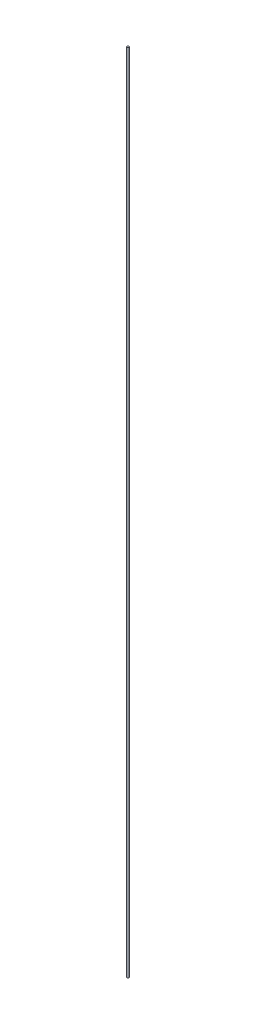
ISO-10303-21;
HEADER;
FILE_DESCRIPTION(('STEP AP214'),'2;1');
FILE_NAME('part.step','',(''),(''),'','','');
FILE_SCHEMA(('AUTOMOTIVE_DESIGN { 1 0 10303 214 1 1 1 1 }'));
ENDSEC;
DATA;
#1=APPLICATION_CONTEXT('core data for automotive mechanical design processes');
#2=APPLICATION_PROTOCOL_DEFINITION('international standard','automotive_design',2000,#1);
#3=PRODUCT_CONTEXT('',#1,'mechanical');
#4=PRODUCT('Part','Part','',(#3));
#5=PRODUCT_RELATED_PRODUCT_CATEGORY('part','',(#4));
#6=PRODUCT_DEFINITION_FORMATION('','',#4);
#7=PRODUCT_DEFINITION_CONTEXT('part definition',#1,'design');
#8=PRODUCT_DEFINITION('design','',#6,#7);
#9=PRODUCT_DEFINITION_SHAPE('','',#8);
#10=(LENGTH_UNIT() NAMED_UNIT(*) SI_UNIT(.MILLI.,.METRE.));
#11=(NAMED_UNIT(*) PLANE_ANGLE_UNIT() SI_UNIT($,.RADIAN.));
#12=(NAMED_UNIT(*) SI_UNIT($,.STERADIAN.) SOLID_ANGLE_UNIT());
#13=UNCERTAINTY_MEASURE_WITH_UNIT(LENGTH_MEASURE(1.E-05),#10,'distance_accuracy_value','');
#14=(GEOMETRIC_REPRESENTATION_CONTEXT(3) GLOBAL_UNCERTAINTY_ASSIGNED_CONTEXT((#13)) GLOBAL_UNIT_ASSIGNED_CONTEXT((#10,
#11,#12)) REPRESENTATION_CONTEXT('',''));
#15=CARTESIAN_POINT('',(0.,0.,0.));
#16=DIRECTION('',(0.,0.,1.));
#17=DIRECTION('',(1.,0.,0.));
#18=AXIS2_PLACEMENT_3D('',#15,#16,#17);
#19=CARTESIAN_POINT('',(0.,20.,0.));
#20=DIRECTION('',(0.,-1.,0.));
#21=DIRECTION('',(0.,0.,-1.));
#22=AXIS2_PLACEMENT_3D('',#19,#20,#21);
#23=CYLINDRICAL_SURFACE('',#22,0.025);
#24=CARTESIAN_POINT('',(0.,20.,0.));
#25=DIRECTION('',(0.,1.,0.));
#26=DIRECTION('',(0.,0.,1.));
#27=AXIS2_PLACEMENT_3D('',#24,#25,#26);
#28=CIRCLE('',#27,0.025);
#29=CARTESIAN_POINT('',(0.,20.,0.025));
#30=VERTEX_POINT('',#29);
#31=EDGE_CURVE('E10',#30,#30,#28,.T.);
#32=ORIENTED_EDGE('',*,*,#31,.F.);
#33=EDGE_LOOP('',(#32));
#34=FACE_BOUND('',#33,.T.);
#35=CARTESIAN_POINT('',(0.,0.,0.));
#36=DIRECTION('',(0.,1.,0.));
#37=DIRECTION('',(0.,0.,1.));
#38=AXIS2_PLACEMENT_3D('',#35,#36,#37);
#39=CIRCLE('',#38,0.025);
#40=CARTESIAN_POINT('',(0.,0.,0.025));
#41=VERTEX_POINT('',#40);
#42=EDGE_CURVE('E46',#41,#41,#39,.T.);
#43=ORIENTED_EDGE('',*,*,#42,.T.);
#44=EDGE_LOOP('',(#43));
#45=FACE_BOUND('',#44,.T.);
#46=ADVANCED_FACE('F43',(#34,#45),#23,.T.);
#47=CARTESIAN_POINT('',(0.,20.,0.));
#48=DIRECTION('',(0.,1.,0.));
#49=DIRECTION('',(0.,0.,1.));
#50=AXIS2_PLACEMENT_3D('',#47,#48,#49);
#51=PLANE('',#50);
#52=ORIENTED_EDGE('',*,*,#31,.T.);
#53=EDGE_LOOP('',(#52));
#54=FACE_BOUND('',#53,.T.);
#55=ADVANCED_FACE('F60',(#54),#51,.T.);
#56=CARTESIAN_POINT('',(0.,0.,0.));
#57=DIRECTION('',(0.,1.,0.));
#58=DIRECTION('',(0.,0.,1.));
#59=AXIS2_PLACEMENT_3D('',#56,#57,#58);
#60=PLANE('',#59);
#61=ORIENTED_EDGE('',*,*,#42,.F.);
#62=EDGE_LOOP('',(#61));
#63=FACE_BOUND('',#62,.T.);
#64=ADVANCED_FACE('F58',(#63),#60,.F.);
#65=CLOSED_SHELL('',(#46,#55,#64));
#66=MANIFOLD_SOLID_BREP('B2',#65);
#67=ADVANCED_BREP_SHAPE_REPRESENTATION('',(#18,#66),#14);
#68=SHAPE_DEFINITION_REPRESENTATION(#9,#67);
ENDSEC;
END-ISO-10303-21;
